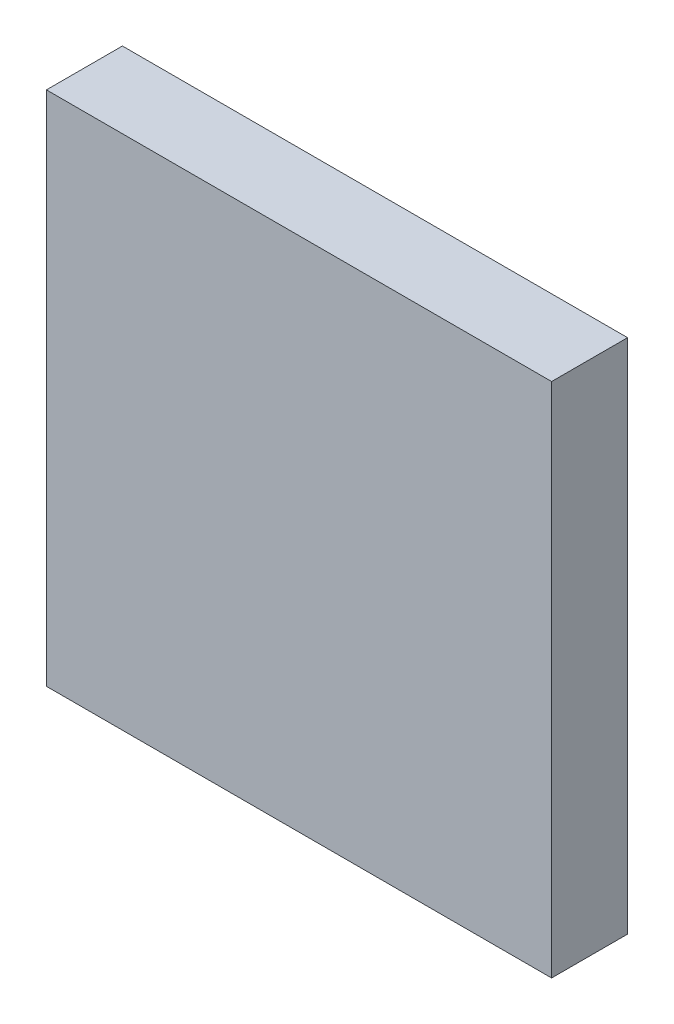
ISO-10303-21;
HEADER;
FILE_DESCRIPTION(('STEP AP214'),'2;1');
FILE_NAME('part.step','',(''),(''),'','','');
FILE_SCHEMA(('AUTOMOTIVE_DESIGN { 1 0 10303 214 1 1 1 1 }'));
ENDSEC;
DATA;
#1=APPLICATION_CONTEXT('core data for automotive mechanical design processes');
#2=APPLICATION_PROTOCOL_DEFINITION('international standard','automotive_design',2000,#1);
#3=PRODUCT_CONTEXT('',#1,'mechanical');
#4=PRODUCT('Part','Part','',(#3));
#5=PRODUCT_RELATED_PRODUCT_CATEGORY('part','',(#4));
#6=PRODUCT_DEFINITION_FORMATION('','',#4);
#7=PRODUCT_DEFINITION_CONTEXT('part definition',#1,'design');
#8=PRODUCT_DEFINITION('design','',#6,#7);
#9=PRODUCT_DEFINITION_SHAPE('','',#8);
#10=(LENGTH_UNIT() NAMED_UNIT(*) SI_UNIT(.MILLI.,.METRE.));
#11=(NAMED_UNIT(*) PLANE_ANGLE_UNIT() SI_UNIT($,.RADIAN.));
#12=(NAMED_UNIT(*) SI_UNIT($,.STERADIAN.) SOLID_ANGLE_UNIT());
#13=UNCERTAINTY_MEASURE_WITH_UNIT(LENGTH_MEASURE(1.E-05),#10,'distance_accuracy_value','');
#14=(GEOMETRIC_REPRESENTATION_CONTEXT(3) GLOBAL_UNCERTAINTY_ASSIGNED_CONTEXT((#13)) GLOBAL_UNIT_ASSIGNED_CONTEXT((#10,
#11,#12)) REPRESENTATION_CONTEXT('',''));
#15=CARTESIAN_POINT('',(0.,0.,0.));
#16=DIRECTION('',(0.,0.,1.));
#17=DIRECTION('',(1.,0.,0.));
#18=AXIS2_PLACEMENT_3D('',#15,#16,#17);
#19=CARTESIAN_POINT('',(33.25,-34.,10.));
#20=DIRECTION('',(-1.,0.,0.));
#21=DIRECTION('',(0.,0.,1.));
#22=AXIS2_PLACEMENT_3D('',#19,#20,#21);
#23=PLANE('',#22);
#24=DIRECTION('',(0.,1.,0.));
#25=VECTOR('',#24,1.);
#26=CARTESIAN_POINT('',(33.25,-34.,0.));
#27=LINE('',#26,#25);
#28=CARTESIAN_POINT('',(33.25,-34.,0.));
#29=VERTEX_POINT('',#28);
#30=CARTESIAN_POINT('',(33.25,34.,0.));
#31=VERTEX_POINT('',#30);
#32=EDGE_CURVE('E107',#29,#31,#27,.T.);
#33=ORIENTED_EDGE('',*,*,#32,.T.);
#34=DIRECTION('',(0.,0.,-1.));
#35=VECTOR('',#34,1.);
#36=CARTESIAN_POINT('',(33.25,34.,10.));
#37=LINE('',#36,#35);
#38=CARTESIAN_POINT('',(33.25,34.,10.));
#39=VERTEX_POINT('',#38);
#40=EDGE_CURVE('E11',#39,#31,#37,.T.);
#41=ORIENTED_EDGE('',*,*,#40,.F.);
#42=DIRECTION('',(0.,1.,0.));
#43=VECTOR('',#42,1.);
#44=CARTESIAN_POINT('',(33.25,-34.,10.));
#45=LINE('',#44,#43);
#46=CARTESIAN_POINT('',(33.25,-34.,10.));
#47=VERTEX_POINT('',#46);
#48=EDGE_CURVE('E91',#47,#39,#45,.T.);
#49=ORIENTED_EDGE('',*,*,#48,.F.);
#50=DIRECTION('',(0.,0.,-1.));
#51=VECTOR('',#50,1.);
#52=CARTESIAN_POINT('',(33.25,-34.,10.));
#53=LINE('',#52,#51);
#54=EDGE_CURVE('E103',#47,#29,#53,.T.);
#55=ORIENTED_EDGE('',*,*,#54,.T.);
#56=EDGE_LOOP('',(#33,#41,#49,#55));
#57=FACE_BOUND('',#56,.T.);
#58=ADVANCED_FACE('F39',(#57),#23,.F.);
#59=CARTESIAN_POINT('',(-33.25,34.,10.));
#60=DIRECTION('',(0.,-1.,0.));
#61=DIRECTION('',(0.,0.,-1.));
#62=AXIS2_PLACEMENT_3D('',#59,#60,#61);
#63=PLANE('',#62);
#64=DIRECTION('',(-1.,0.,0.));
#65=VECTOR('',#64,1.);
#66=CARTESIAN_POINT('',(-33.25,34.,0.));
#67=LINE('',#66,#65);
#68=CARTESIAN_POINT('',(-33.25,34.,0.));
#69=VERTEX_POINT('',#68);
#70=EDGE_CURVE('E96',#31,#69,#67,.T.);
#71=ORIENTED_EDGE('',*,*,#70,.T.);
#72=DIRECTION('',(0.,0.,-1.));
#73=VECTOR('',#72,1.);
#74=CARTESIAN_POINT('',(-33.25,34.,10.));
#75=LINE('',#74,#73);
#76=CARTESIAN_POINT('',(-33.25,34.,10.));
#77=VERTEX_POINT('',#76);
#78=EDGE_CURVE('E48',#77,#69,#75,.T.);
#79=ORIENTED_EDGE('',*,*,#78,.F.);
#80=DIRECTION('',(-1.,0.,0.));
#81=VECTOR('',#80,1.);
#82=CARTESIAN_POINT('',(-33.25,34.,10.));
#83=LINE('',#82,#81);
#84=EDGE_CURVE('E86',#39,#77,#83,.T.);
#85=ORIENTED_EDGE('',*,*,#84,.F.);
#86=ORIENTED_EDGE('',*,*,#40,.T.);
#87=EDGE_LOOP('',(#71,#79,#85,#86));
#88=FACE_BOUND('',#87,.T.);
#89=ADVANCED_FACE('F95',(#88),#63,.F.);
#90=CARTESIAN_POINT('',(-33.25,-34.,10.));
#91=DIRECTION('',(1.,0.,0.));
#92=DIRECTION('',(0.,0.,-1.));
#93=AXIS2_PLACEMENT_3D('',#90,#91,#92);
#94=PLANE('',#93);
#95=DIRECTION('',(0.,-1.,0.));
#96=VECTOR('',#95,1.);
#97=CARTESIAN_POINT('',(-33.25,-34.,0.));
#98=LINE('',#97,#96);
#99=CARTESIAN_POINT('',(-33.25,-34.,0.));
#100=VERTEX_POINT('',#99);
#101=EDGE_CURVE('E73',#69,#100,#98,.T.);
#102=ORIENTED_EDGE('',*,*,#101,.T.);
#103=DIRECTION('',(0.,0.,-1.));
#104=VECTOR('',#103,1.);
#105=CARTESIAN_POINT('',(-33.25,-34.,10.));
#106=LINE('',#105,#104);
#107=CARTESIAN_POINT('',(-33.25,-34.,10.));
#108=VERTEX_POINT('',#107);
#109=EDGE_CURVE('E98',#108,#100,#106,.T.);
#110=ORIENTED_EDGE('',*,*,#109,.F.);
#111=DIRECTION('',(0.,-1.,0.));
#112=VECTOR('',#111,1.);
#113=CARTESIAN_POINT('',(-33.25,-34.,10.));
#114=LINE('',#113,#112);
#115=EDGE_CURVE('E89',#77,#108,#114,.T.);
#116=ORIENTED_EDGE('',*,*,#115,.F.);
#117=ORIENTED_EDGE('',*,*,#78,.T.);
#118=EDGE_LOOP('',(#102,#110,#116,#117));
#119=FACE_BOUND('',#118,.T.);
#120=ADVANCED_FACE('F99',(#119),#94,.F.);
#121=CARTESIAN_POINT('',(-33.25,-34.,10.));
#122=DIRECTION('',(0.,1.,0.));
#123=DIRECTION('',(0.,0.,1.));
#124=AXIS2_PLACEMENT_3D('',#121,#122,#123);
#125=PLANE('',#124);
#126=DIRECTION('',(1.,0.,0.));
#127=VECTOR('',#126,1.);
#128=CARTESIAN_POINT('',(-33.25,-34.,0.));
#129=LINE('',#128,#127);
#130=EDGE_CURVE('E79',#100,#29,#129,.T.);
#131=ORIENTED_EDGE('',*,*,#130,.T.);
#132=ORIENTED_EDGE('',*,*,#54,.F.);
#133=DIRECTION('',(1.,0.,0.));
#134=VECTOR('',#133,1.);
#135=CARTESIAN_POINT('',(-33.25,-34.,10.));
#136=LINE('',#135,#134);
#137=EDGE_CURVE('E56',#108,#47,#136,.T.);
#138=ORIENTED_EDGE('',*,*,#137,.F.);
#139=ORIENTED_EDGE('',*,*,#109,.T.);
#140=EDGE_LOOP('',(#131,#132,#138,#139));
#141=FACE_BOUND('',#140,.T.);
#142=ADVANCED_FACE('F120',(#141),#125,.F.);
#143=CARTESIAN_POINT('',(0.,0.,10.));
#144=DIRECTION('',(0.,0.,-1.));
#145=DIRECTION('',(-1.,0.,0.));
#146=AXIS2_PLACEMENT_3D('',#143,#144,#145);
#147=PLANE('',#146);
#148=ORIENTED_EDGE('',*,*,#48,.T.);
#149=ORIENTED_EDGE('',*,*,#84,.T.);
#150=ORIENTED_EDGE('',*,*,#115,.T.);
#151=ORIENTED_EDGE('',*,*,#137,.T.);
#152=EDGE_LOOP('',(#148,#149,#150,#151));
#153=FACE_BOUND('',#152,.T.);
#154=ADVANCED_FACE('F87',(#153),#147,.F.);
#155=CARTESIAN_POINT('',(0.,0.,0.));
#156=DIRECTION('',(0.,0.,-1.));
#157=DIRECTION('',(-1.,0.,0.));
#158=AXIS2_PLACEMENT_3D('',#155,#156,#157);
#159=PLANE('',#158);
#160=ORIENTED_EDGE('',*,*,#32,.F.);
#161=ORIENTED_EDGE('',*,*,#130,.F.);
#162=ORIENTED_EDGE('',*,*,#101,.F.);
#163=ORIENTED_EDGE('',*,*,#70,.F.);
#164=EDGE_LOOP('',(#160,#161,#162,#163));
#165=FACE_BOUND('',#164,.T.);
#166=ADVANCED_FACE('F123',(#165),#159,.T.);
#167=CLOSED_SHELL('',(#58,#89,#120,#142,#154,#166));
#168=MANIFOLD_SOLID_BREP('B2',#167);
#169=ADVANCED_BREP_SHAPE_REPRESENTATION('',(#18,#168),#14);
#170=SHAPE_DEFINITION_REPRESENTATION(#9,#169);
ENDSEC;
END-ISO-10303-21;
